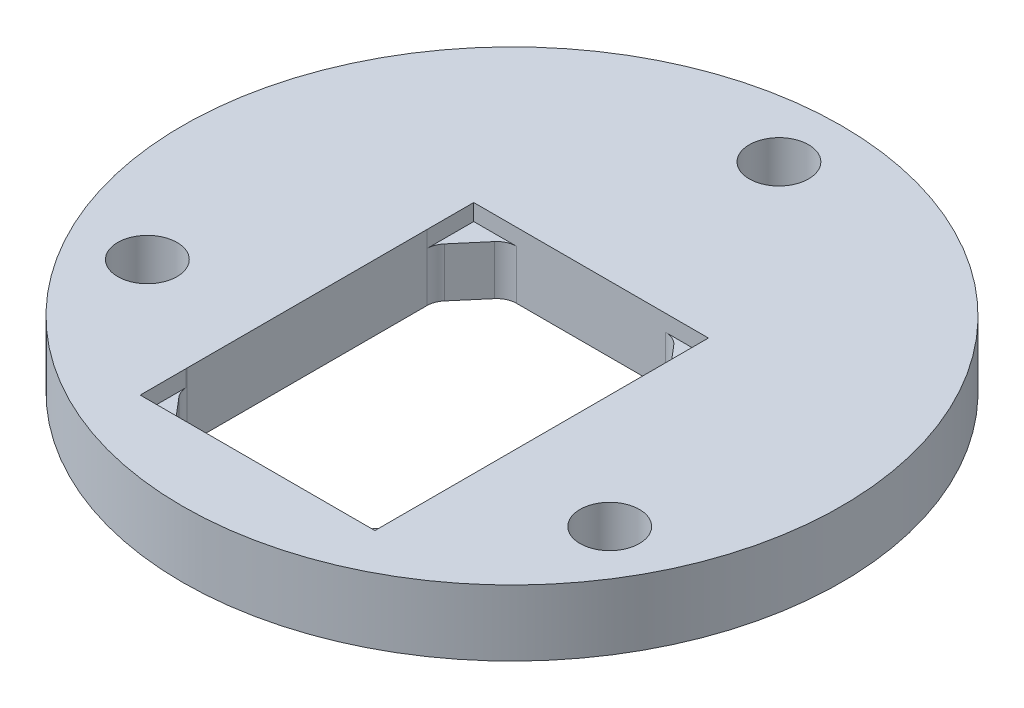
ISO-10303-21;
HEADER;
FILE_DESCRIPTION(('STEP AP214'),'2;1');
FILE_NAME('part.step','',(''),(''),'','','');
FILE_SCHEMA(('AUTOMOTIVE_DESIGN { 1 0 10303 214 1 1 1 1 }'));
ENDSEC;
DATA;
#1=APPLICATION_CONTEXT('core data for automotive mechanical design processes');
#2=APPLICATION_PROTOCOL_DEFINITION('international standard','automotive_design',2000,#1);
#3=PRODUCT_CONTEXT('',#1,'mechanical');
#4=PRODUCT('Part','Part','',(#3));
#5=PRODUCT_RELATED_PRODUCT_CATEGORY('part','',(#4));
#6=PRODUCT_DEFINITION_FORMATION('','',#4);
#7=PRODUCT_DEFINITION_CONTEXT('part definition',#1,'design');
#8=PRODUCT_DEFINITION('design','',#6,#7);
#9=PRODUCT_DEFINITION_SHAPE('','',#8);
#10=(LENGTH_UNIT() NAMED_UNIT(*) SI_UNIT(.MILLI.,.METRE.));
#11=(NAMED_UNIT(*) PLANE_ANGLE_UNIT() SI_UNIT($,.RADIAN.));
#12=(NAMED_UNIT(*) SI_UNIT($,.STERADIAN.) SOLID_ANGLE_UNIT());
#13=UNCERTAINTY_MEASURE_WITH_UNIT(LENGTH_MEASURE(1.E-05),#10,'distance_accuracy_value','');
#14=(GEOMETRIC_REPRESENTATION_CONTEXT(3) GLOBAL_UNCERTAINTY_ASSIGNED_CONTEXT((#13)) GLOBAL_UNIT_ASSIGNED_CONTEXT((#10,
#11,#12)) REPRESENTATION_CONTEXT('',''));
#15=CARTESIAN_POINT('',(0.,0.,0.));
#16=DIRECTION('',(0.,0.,1.));
#17=DIRECTION('',(1.,0.,0.));
#18=AXIS2_PLACEMENT_3D('',#15,#16,#17);
#19=CARTESIAN_POINT('',(-23.4903640908086,-25.,-15.7319703997902));
#20=DIRECTION('',(0.,1.,0.));
#21=DIRECTION('',(0.,0.,1.));
#22=AXIS2_PLACEMENT_3D('',#19,#20,#21);
#23=CYLINDRICAL_SURFACE('',#22,3.00000000000003);
#24=CARTESIAN_POINT('',(-23.4903640908086,7.5,-15.7319703997902));
#25=DIRECTION('',(0.,1.,0.));
#26=DIRECTION('',(0.,0.,1.));
#27=AXIS2_PLACEMENT_3D('',#24,#25,#26);
#28=CIRCLE('',#27,3.00000000000003);
#29=CARTESIAN_POINT('',(-26.490364083733,7.5,-15.7319703997902));
#30=VERTEX_POINT('',#29);
#31=CARTESIAN_POINT('',(-25.7740709174085,7.5,-17.6773966076278));
#32=VERTEX_POINT('',#31);
#33=EDGE_CURVE('E317',#30,#32,#28,.F.);
#34=ORIENTED_EDGE('',*,*,#33,.F.);
#35=DIRECTION('',(0.,1.,0.));
#36=VECTOR('',#35,1.);
#37=CARTESIAN_POINT('',(-26.4903640872708,-25.,-15.7319703997902));
#38=LINE('',#37,#36);
#39=CARTESIAN_POINT('',(-26.490364083733,10.,-15.7319703997902));
#40=VERTEX_POINT('',#39);
#41=EDGE_CURVE('E12',#40,#30,#38,.F.);
#42=ORIENTED_EDGE('',*,*,#41,.F.);
#43=CARTESIAN_POINT('',(-23.4903640908086,10.,-15.7319703997902));
#44=DIRECTION('',(0.,1.,0.));
#45=DIRECTION('',(0.,0.,1.));
#46=AXIS2_PLACEMENT_3D('',#43,#44,#45);
#47=CIRCLE('',#46,3.00000000000003);
#48=CARTESIAN_POINT('',(-26.490364083733,10.,-15.731764355845));
#49=VERTEX_POINT('',#48);
#50=EDGE_CURVE('E334',#40,#49,#47,.T.);
#51=ORIENTED_EDGE('',*,*,#50,.T.);
#52=DIRECTION('',(0.,1.,0.));
#53=VECTOR('',#52,1.);
#54=CARTESIAN_POINT('',(-26.490364083733,-25.,-15.731764355845));
#55=LINE('',#54,#53);
#56=CARTESIAN_POINT('',(-26.490364083733,0.,-15.731764355845));
#57=VERTEX_POINT('',#56);
#58=EDGE_CURVE('E359',#57,#49,#55,.T.);
#59=ORIENTED_EDGE('',*,*,#58,.F.);
#60=CARTESIAN_POINT('',(-23.4903640908086,0.,-15.7319703997902));
#61=DIRECTION('',(0.,1.,0.));
#62=DIRECTION('',(0.,0.,1.));
#63=AXIS2_PLACEMENT_3D('',#60,#61,#62);
#64=CIRCLE('',#63,3.00000000000003);
#65=CARTESIAN_POINT('',(-25.7740709174085,0.,-17.6773966076278));
#66=VERTEX_POINT('',#65);
#67=EDGE_CURVE('E426',#66,#57,#64,.T.);
#68=ORIENTED_EDGE('',*,*,#67,.F.);
#69=DIRECTION('',(0.,1.,0.));
#70=VECTOR('',#69,1.);
#71=CARTESIAN_POINT('',(-25.7740709174085,-25.,-17.6773966076278));
#72=LINE('',#71,#70);
#73=EDGE_CURVE('E361',#66,#32,#72,.T.);
#74=ORIENTED_EDGE('',*,*,#73,.T.);
#75=EDGE_LOOP('',(#34,#42,#51,#59,#68,#74));
#76=FACE_BOUND('',#75,.T.);
#77=ADVANCED_FACE('F91',(#76),#23,.F.);
#78=CARTESIAN_POINT('',(-23.6618651070982,-25.,-20.1568835235315));
#79=DIRECTION('',(0.761235608866611,0.,0.648475402612528));
#80=DIRECTION('',(0.648475402612528,0.,-0.761235608866611));
#81=AXIS2_PLACEMENT_3D('',#78,#79,#80);
#82=PLANE('',#81);
#83=DIRECTION('',(0.,1.,0.));
#84=VECTOR('',#83,1.);
#85=CARTESIAN_POINT('',(-22.2815709104518,-25.,-21.7771903061266));
#86=LINE('',#85,#84);
#87=CARTESIAN_POINT('',(-22.2815709104518,0.,-21.7771903061266));
#88=VERTEX_POINT('',#87);
#89=CARTESIAN_POINT('',(-22.2815709104518,7.5,-21.7771903061266));
#90=VERTEX_POINT('',#89);
#91=EDGE_CURVE('E364',#88,#90,#86,.T.);
#92=ORIENTED_EDGE('',*,*,#91,.T.);
#93=DIRECTION('',(-0.648475402612528,0.,0.761235608866611));
#94=VECTOR('',#93,1.);
#95=CARTESIAN_POINT('',(-23.6618651070982,7.5,-20.1568835235315));
#96=LINE('',#95,#94);
#97=EDGE_CURVE('E106',#90,#32,#96,.T.);
#98=ORIENTED_EDGE('',*,*,#97,.T.);
#99=ORIENTED_EDGE('',*,*,#73,.F.);
#100=DIRECTION('',(0.648475402612528,0.,-0.761235608866611));
#101=VECTOR('',#100,1.);
#102=CARTESIAN_POINT('',(-21.9661662866536,0.,-22.1474390925403));
#103=LINE('',#102,#101);
#104=EDGE_CURVE('E424',#66,#88,#103,.T.);
#105=ORIENTED_EDGE('',*,*,#104,.T.);
#106=EDGE_LOOP('',(#92,#98,#99,#105));
#107=FACE_BOUND('',#106,.T.);
#108=ADVANCED_FACE('F489',(#107),#82,.T.);
#109=CARTESIAN_POINT('',(-19.997864083852,-25.,-19.831764098289));
#110=DIRECTION('',(0.,1.,0.));
#111=DIRECTION('',(0.,0.,1.));
#112=AXIS2_PLACEMENT_3D('',#109,#110,#111);
#113=CYLINDRICAL_SURFACE('',#112,3.);
#114=CARTESIAN_POINT('',(-19.997864083852,7.5,-19.831764098289));
#115=DIRECTION('',(0.,1.,0.));
#116=DIRECTION('',(0.,0.,1.));
#117=AXIS2_PLACEMENT_3D('',#114,#115,#116);
#118=CIRCLE('',#117,3.);
#119=CARTESIAN_POINT('',(-19.997864083852,7.5,-22.831764098289));
#120=VERTEX_POINT('',#119);
#121=EDGE_CURVE('E314',#90,#120,#118,.F.);
#122=ORIENTED_EDGE('',*,*,#121,.F.);
#123=ORIENTED_EDGE('',*,*,#91,.F.);
#124=CARTESIAN_POINT('',(-19.997864083852,0.,-19.831764098289));
#125=DIRECTION('',(0.,1.,0.));
#126=DIRECTION('',(0.,0.,1.));
#127=AXIS2_PLACEMENT_3D('',#124,#125,#126);
#128=CIRCLE('',#127,3.);
#129=CARTESIAN_POINT('',(-19.997864083852,0.,-22.831764098289));
#130=VERTEX_POINT('',#129);
#131=EDGE_CURVE('E421',#130,#88,#128,.T.);
#132=ORIENTED_EDGE('',*,*,#131,.F.);
#133=DIRECTION('',(0.,1.,0.));
#134=VECTOR('',#133,1.);
#135=CARTESIAN_POINT('',(-19.997864083852,-25.,-22.831764098289));
#136=LINE('',#135,#134);
#137=EDGE_CURVE('E367',#130,#120,#136,.T.);
#138=ORIENTED_EDGE('',*,*,#137,.T.);
#139=EDGE_LOOP('',(#122,#123,#132,#138));
#140=FACE_BOUND('',#139,.T.);
#141=ADVANCED_FACE('F495',(#140),#113,.F.);
#142=CARTESIAN_POINT('',(2.63213591614804,-25.,-19.831764098289));
#143=DIRECTION('',(0.,1.,0.));
#144=DIRECTION('',(0.,0.,1.));
#145=AXIS2_PLACEMENT_3D('',#142,#143,#144);
#146=CYLINDRICAL_SURFACE('',#145,3.);
#147=CARTESIAN_POINT('',(2.63213591614804,7.5,-19.831764098289));
#148=DIRECTION('',(0.,1.,0.));
#149=DIRECTION('',(0.,0.,1.));
#150=AXIS2_PLACEMENT_3D('',#147,#148,#149);
#151=CIRCLE('',#150,3.);
#152=CARTESIAN_POINT('',(2.63213591614804,7.5,-22.831764098289));
#153=VERTEX_POINT('',#152);
#154=CARTESIAN_POINT('',(4.91891456032033,7.5,-21.773578567428));
#155=VERTEX_POINT('',#154);
#156=EDGE_CURVE('E312',#153,#155,#151,.F.);
#157=ORIENTED_EDGE('',*,*,#156,.F.);
#158=DIRECTION('',(0.,1.,0.));
#159=VECTOR('',#158,1.);
#160=CARTESIAN_POINT('',(2.63213591614804,-25.,-22.831764098289));
#161=LINE('',#160,#159);
#162=CARTESIAN_POINT('',(2.63213591614804,0.,-22.831764098289));
#163=VERTEX_POINT('',#162);
#164=EDGE_CURVE('E370',#163,#153,#161,.T.);
#165=ORIENTED_EDGE('',*,*,#164,.F.);
#166=CARTESIAN_POINT('',(2.63213591614804,0.,-19.831764098289));
#167=DIRECTION('',(0.,1.,0.));
#168=DIRECTION('',(0.,0.,1.));
#169=AXIS2_PLACEMENT_3D('',#166,#167,#168);
#170=CIRCLE('',#169,3.);
#171=CARTESIAN_POINT('',(4.91891456032033,0.,-21.773578567428));
#172=VERTEX_POINT('',#171);
#173=EDGE_CURVE('E416',#172,#163,#170,.T.);
#174=ORIENTED_EDGE('',*,*,#173,.F.);
#175=DIRECTION('',(0.,1.,0.));
#176=VECTOR('',#175,1.);
#177=CARTESIAN_POINT('',(4.91891456032033,-25.,-21.773578567428));
#178=LINE('',#177,#176);
#179=EDGE_CURVE('E373',#172,#155,#178,.T.);
#180=ORIENTED_EDGE('',*,*,#179,.T.);
#181=EDGE_LOOP('',(#157,#165,#174,#180));
#182=FACE_BOUND('',#181,.T.);
#183=ADVANCED_FACE('F505',(#182),#146,.F.);
#184=CARTESIAN_POINT('',(13.6009256354083,-25.,-11.5492044933272));
#185=DIRECTION('',(-0.76225954805743,0.,0.647271489712998));
#186=DIRECTION('',(0.647271489712998,0.,0.76225954805743));
#187=AXIS2_PLACEMENT_3D('',#184,#185,#186);
#188=PLANE('',#187);
#189=DIRECTION('',(0.,1.,0.));
#190=VECTOR('',#189,1.);
#191=CARTESIAN_POINT('',(8.40891456032033,-25.,-17.663578567428));
#192=LINE('',#191,#190);
#193=CARTESIAN_POINT('',(8.40891456032033,0.,-17.663578567428));
#194=VERTEX_POINT('',#193);
#195=CARTESIAN_POINT('',(8.40891456032033,7.5,-17.663578567428));
#196=VERTEX_POINT('',#195);
#197=EDGE_CURVE('E376',#194,#196,#192,.T.);
#198=ORIENTED_EDGE('',*,*,#197,.T.);
#199=DIRECTION('',(-0.647271489712998,0.,-0.76225954805743));
#200=VECTOR('',#199,1.);
#201=CARTESIAN_POINT('',(13.6009256354083,7.5,-11.5492044933272));
#202=LINE('',#201,#200);
#203=EDGE_CURVE('E114',#196,#155,#202,.T.);
#204=ORIENTED_EDGE('',*,*,#203,.T.);
#205=ORIENTED_EDGE('',*,*,#179,.F.);
#206=DIRECTION('',(0.647271489712998,0.,0.76225954805743));
#207=VECTOR('',#206,1.);
#208=CARTESIAN_POINT('',(4.61887770380443,0.,-22.1269171004597));
#209=LINE('',#208,#207);
#210=EDGE_CURVE('E414',#172,#194,#209,.T.);
#211=ORIENTED_EDGE('',*,*,#210,.T.);
#212=EDGE_LOOP('',(#198,#204,#205,#211));
#213=FACE_BOUND('',#212,.T.);
#214=ADVANCED_FACE('F514',(#213),#188,.T.);
#215=CARTESIAN_POINT('',(16.0358574951463,-25.,13.650034794649));
#216=DIRECTION('',(-0.761480874528557,0.,-0.648187378562113));
#217=DIRECTION('',(-0.648187378562113,0.,0.761480874528557));
#218=AXIS2_PLACEMENT_3D('',#215,#216,#217);
#219=PLANE('',#218);
#220=DIRECTION('',(0.,1.,0.));
#221=VECTOR('',#220,1.);
#222=CARTESIAN_POINT('',(4.91657853973371,-25.,26.7127980373973));
#223=LINE('',#222,#221);
#224=CARTESIAN_POINT('',(4.91657853973371,0.,26.7127980373973));
#225=VERTEX_POINT('',#224);
#226=CARTESIAN_POINT('',(4.91657853973371,7.5,26.7127980373973));
#227=VERTEX_POINT('',#226);
#228=EDGE_CURVE('E345',#225,#227,#223,.T.);
#229=ORIENTED_EDGE('',*,*,#228,.T.);
#230=DIRECTION('',(0.648187378562113,0.,-0.761480874528557));
#231=VECTOR('',#230,1.);
#232=CARTESIAN_POINT('',(16.0358574951463,7.5,13.650034794649));
#233=LINE('',#232,#231);
#234=CARTESIAN_POINT('',(8.40657853973371,7.5,22.6127980373973));
#235=VERTEX_POINT('',#234);
#236=EDGE_CURVE('E304',#227,#235,#233,.T.);
#237=ORIENTED_EDGE('',*,*,#236,.T.);
#238=DIRECTION('',(0.,1.,0.));
#239=VECTOR('',#238,1.);
#240=CARTESIAN_POINT('',(8.40657853973371,-25.,22.6127980373973));
#241=LINE('',#240,#239);
#242=CARTESIAN_POINT('',(8.40657853973371,0.,22.6127980373973));
#243=VERTEX_POINT('',#242);
#244=EDGE_CURVE('E384',#243,#235,#241,.T.);
#245=ORIENTED_EDGE('',*,*,#244,.F.);
#246=DIRECTION('',(-0.648187378562113,0.,0.761480874528557));
#247=VECTOR('',#246,1.);
#248=CARTESIAN_POINT('',(17.7341462093864,0.,11.654910517175));
#249=LINE('',#248,#247);
#250=EDGE_CURVE('E404',#243,#225,#249,.T.);
#251=ORIENTED_EDGE('',*,*,#250,.T.);
#252=EDGE_LOOP('',(#229,#237,#245,#251));
#253=FACE_BOUND('',#252,.T.);
#254=ADVANCED_FACE('F465',(#253),#219,.T.);
#255=CARTESIAN_POINT('',(2.63213591614804,-25.,24.768235901711));
#256=DIRECTION('',(0.,1.,0.));
#257=DIRECTION('',(0.,0.,1.));
#258=AXIS2_PLACEMENT_3D('',#255,#256,#257);
#259=CYLINDRICAL_SURFACE('',#258,3.);
#260=CARTESIAN_POINT('',(2.63213591614804,7.5,24.768235901711));
#261=DIRECTION('',(0.,1.,0.));
#262=DIRECTION('',(0.,0.,1.));
#263=AXIS2_PLACEMENT_3D('',#260,#261,#262);
#264=CIRCLE('',#263,3.);
#265=CARTESIAN_POINT('',(2.63213591614804,7.5,27.768235901711));
#266=VERTEX_POINT('',#265);
#267=EDGE_CURVE('E302',#227,#266,#264,.F.);
#268=ORIENTED_EDGE('',*,*,#267,.F.);
#269=ORIENTED_EDGE('',*,*,#228,.F.);
#270=CARTESIAN_POINT('',(2.63213591614804,0.,24.768235901711));
#271=DIRECTION('',(0.,1.,0.));
#272=DIRECTION('',(0.,0.,1.));
#273=AXIS2_PLACEMENT_3D('',#270,#271,#272);
#274=CIRCLE('',#273,3.);
#275=CARTESIAN_POINT('',(2.63213591614804,0.,27.768235901711));
#276=VERTEX_POINT('',#275);
#277=EDGE_CURVE('E401',#276,#225,#274,.T.);
#278=ORIENTED_EDGE('',*,*,#277,.F.);
#279=DIRECTION('',(0.,1.,0.));
#280=VECTOR('',#279,1.);
#281=CARTESIAN_POINT('',(2.63213591614804,-25.,27.768235901711));
#282=LINE('',#281,#280);
#283=EDGE_CURVE('E346',#276,#266,#282,.T.);
#284=ORIENTED_EDGE('',*,*,#283,.T.);
#285=EDGE_LOOP('',(#268,#269,#278,#284));
#286=FACE_BOUND('',#285,.T.);
#287=ADVANCED_FACE('F468',(#286),#259,.F.);
#288=CARTESIAN_POINT('',(-20.002864083852,-25.,24.768235901711));
#289=DIRECTION('',(0.,1.,0.));
#290=DIRECTION('',(0.,0.,1.));
#291=AXIS2_PLACEMENT_3D('',#288,#289,#290);
#292=CYLINDRICAL_SURFACE('',#291,3.);
#293=CARTESIAN_POINT('',(-20.002864083852,7.5,24.768235901711));
#294=DIRECTION('',(0.,1.,0.));
#295=DIRECTION('',(0.,0.,1.));
#296=AXIS2_PLACEMENT_3D('',#293,#294,#295);
#297=CIRCLE('',#296,3.);
#298=CARTESIAN_POINT('',(-20.002864083852,7.5,27.768235901711));
#299=VERTEX_POINT('',#298);
#300=CARTESIAN_POINT('',(-22.2873067074376,7.5,26.7127980373973));
#301=VERTEX_POINT('',#300);
#302=EDGE_CURVE('E294',#299,#301,#297,.F.);
#303=ORIENTED_EDGE('',*,*,#302,.F.);
#304=DIRECTION('',(0.,1.,0.));
#305=VECTOR('',#304,1.);
#306=CARTESIAN_POINT('',(-20.002864083852,-25.,27.768235901711));
#307=LINE('',#306,#305);
#308=CARTESIAN_POINT('',(-20.002864083852,0.,27.768235901711));
#309=VERTEX_POINT('',#308);
#310=EDGE_CURVE('E276',#309,#299,#307,.T.);
#311=ORIENTED_EDGE('',*,*,#310,.F.);
#312=CARTESIAN_POINT('',(-20.002864083852,0.,24.768235901711));
#313=DIRECTION('',(0.,1.,0.));
#314=DIRECTION('',(0.,0.,1.));
#315=AXIS2_PLACEMENT_3D('',#312,#313,#314);
#316=CIRCLE('',#315,3.);
#317=CARTESIAN_POINT('',(-22.2873067074376,0.,26.7127980373973));
#318=VERTEX_POINT('',#317);
#319=EDGE_CURVE('E396',#318,#309,#316,.T.);
#320=ORIENTED_EDGE('',*,*,#319,.F.);
#321=DIRECTION('',(0.,1.,0.));
#322=VECTOR('',#321,1.);
#323=CARTESIAN_POINT('',(-22.2873067074376,-25.,26.7127980373973));
#324=LINE('',#323,#322);
#325=EDGE_CURVE('E351',#318,#301,#324,.T.);
#326=ORIENTED_EDGE('',*,*,#325,.T.);
#327=EDGE_LOOP('',(#303,#311,#320,#326));
#328=FACE_BOUND('',#327,.T.);
#329=ADVANCED_FACE('F530',(#328),#292,.F.);
#330=CARTESIAN_POINT('',(-26.1083284593411,-25.,22.2239186153904));
#331=DIRECTION('',(0.761480874528557,0.,-0.648187378562114));
#332=DIRECTION('',(-0.648187378562114,0.,-0.761480874528557));
#333=AXIS2_PLACEMENT_3D('',#330,#331,#332);
#334=PLANE('',#333);
#335=DIRECTION('',(0.,1.,0.));
#336=VECTOR('',#335,1.);
#337=CARTESIAN_POINT('',(-25.7773067074376,-25.,22.6127980373973));
#338=LINE('',#337,#336);
#339=CARTESIAN_POINT('',(-25.7773067074376,0.,22.6127980373973));
#340=VERTEX_POINT('',#339);
#341=CARTESIAN_POINT('',(-25.7773067074376,7.5,22.6127980373973));
#342=VERTEX_POINT('',#341);
#343=EDGE_CURVE('E354',#340,#342,#338,.T.);
#344=ORIENTED_EDGE('',*,*,#343,.T.);
#345=DIRECTION('',(0.648187378562114,0.,0.761480874528557));
#346=VECTOR('',#345,1.);
#347=CARTESIAN_POINT('',(-26.1083284593411,7.5,22.2239186153904));
#348=LINE('',#347,#346);
#349=EDGE_CURVE('E434',#342,#301,#348,.T.);
#350=ORIENTED_EDGE('',*,*,#349,.T.);
#351=ORIENTED_EDGE('',*,*,#325,.F.);
#352=DIRECTION('',(-0.648187378562114,0.,-0.761480874528557));
#353=VECTOR('',#352,1.);
#354=CARTESIAN_POINT('',(-35.1027736427018,0.,11.6573784286343));
#355=LINE('',#354,#353);
#356=EDGE_CURVE('E392',#318,#340,#355,.T.);
#357=ORIENTED_EDGE('',*,*,#356,.T.);
#358=EDGE_LOOP('',(#344,#350,#351,#357));
#359=FACE_BOUND('',#358,.T.);
#360=ADVANCED_FACE('F598',(#359),#334,.T.);
#361=CARTESIAN_POINT('',(-8.68286408385213,10.,-10.831764098289));
#362=DIRECTION('',(0.,-1.,0.));
#363=DIRECTION('',(0.,0.,-1.));
#364=AXIS2_PLACEMENT_3D('',#361,#362,#363);
#365=CYLINDRICAL_SURFACE('',#364,50.);
#366=CARTESIAN_POINT('',(-8.68286408385213,10.,-10.831764098289));
#367=DIRECTION('',(0.,1.,0.));
#368=DIRECTION('',(0.,0.,1.));
#369=AXIS2_PLACEMENT_3D('',#366,#367,#368);
#370=CIRCLE('',#369,50.);
#371=CARTESIAN_POINT('',(-8.68286408385213,10.,39.168235901711));
#372=VERTEX_POINT('',#371);
#373=EDGE_CURVE('E389',#372,#372,#370,.T.);
#374=ORIENTED_EDGE('',*,*,#373,.F.);
#375=EDGE_LOOP('',(#374));
#376=FACE_BOUND('',#375,.T.);
#377=CARTESIAN_POINT('',(-8.68286408385213,0.,-10.831764098289));
#378=DIRECTION('',(0.,1.,0.));
#379=DIRECTION('',(0.,0.,1.));
#380=AXIS2_PLACEMENT_3D('',#377,#378,#379);
#381=CIRCLE('',#380,50.);
#382=CARTESIAN_POINT('',(-8.68286408385213,0.,39.168235901711));
#383=VERTEX_POINT('',#382);
#384=EDGE_CURVE('E349',#383,#383,#381,.T.);
#385=ORIENTED_EDGE('',*,*,#384,.T.);
#386=EDGE_LOOP('',(#385));
#387=FACE_BOUND('',#386,.T.);
#388=ADVANCED_FACE('F93',(#376,#387),#365,.T.);
#389=CARTESIAN_POINT('',(-8.68286408385213,10.,-10.831764098289));
#390=DIRECTION('',(0.,1.,0.));
#391=DIRECTION('',(0.,0.,1.));
#392=AXIS2_PLACEMENT_3D('',#389,#390,#391);
#393=PLANE('',#392);
#394=CARTESIAN_POINT('',(-8.68286408385213,10.,-51.331764098289));
#395=DIRECTION('',(0.,1.,0.));
#396=DIRECTION('',(0.,0.,1.));
#397=AXIS2_PLACEMENT_3D('',#394,#395,#396);
#398=CIRCLE('',#397,4.5);
#399=CARTESIAN_POINT('',(-8.68286408385213,10.,-46.831764098289));
#400=VERTEX_POINT('',#399);
#401=EDGE_CURVE('E560',#400,#400,#398,.T.);
#402=ORIENTED_EDGE('',*,*,#401,.F.);
#403=EDGE_LOOP('',(#402));
#404=FACE_BOUND('',#403,.T.);
#405=CARTESIAN_POINT('',(-43.7568929371218,10.,9.41823590171113));
#406=DIRECTION('',(0.,1.,0.));
#407=DIRECTION('',(0.,0.,1.));
#408=AXIS2_PLACEMENT_3D('',#405,#406,#407);
#409=CIRCLE('',#408,4.50000000000001);
#410=CARTESIAN_POINT('',(-43.7568929371218,10.,13.9182359017111));
#411=VERTEX_POINT('',#410);
#412=EDGE_CURVE('E556',#411,#411,#409,.T.);
#413=ORIENTED_EDGE('',*,*,#412,.F.);
#414=EDGE_LOOP('',(#413));
#415=FACE_BOUND('',#414,.T.);
#416=CARTESIAN_POINT('',(26.3911647694175,10.,9.41823590171113));
#417=DIRECTION('',(0.,1.,0.));
#418=DIRECTION('',(0.,0.,1.));
#419=AXIS2_PLACEMENT_3D('',#416,#417,#418);
#420=CIRCLE('',#419,4.5);
#421=CARTESIAN_POINT('',(26.3911647694175,10.,13.9182359017111));
#422=VERTEX_POINT('',#421);
#423=EDGE_CURVE('E552',#422,#422,#420,.T.);
#424=ORIENTED_EDGE('',*,*,#423,.F.);
#425=EDGE_LOOP('',(#424));
#426=FACE_BOUND('',#425,.T.);
#427=DIRECTION('',(0.,0.,1.));
#428=VECTOR('',#427,1.);
#429=CARTESIAN_POINT('',(-26.490364083733,10.,-22.831764098289));
#430=LINE('',#429,#428);
#431=CARTESIAN_POINT('',(-26.490364083733,10.,-22.831764098289));
#432=VERTEX_POINT('',#431);
#433=EDGE_CURVE('E287',#432,#40,#430,.T.);
#434=ORIENTED_EDGE('',*,*,#433,.F.);
#435=DIRECTION('',(1.,0.,0.));
#436=VECTOR('',#435,1.);
#437=CARTESIAN_POINT('',(0.,10.,-22.831764098289));
#438=LINE('',#437,#436);
#439=CARTESIAN_POINT('',(9.11713591614804,10.,-22.831764098289));
#440=VERTEX_POINT('',#439);
#441=EDGE_CURVE('E332',#432,#440,#438,.T.);
#442=ORIENTED_EDGE('',*,*,#441,.T.);
#443=DIRECTION('',(0.,0.,-1.));
#444=VECTOR('',#443,1.);
#445=CARTESIAN_POINT('',(9.11713591614804,10.,-22.831764098289));
#446=LINE('',#445,#444);
#447=CARTESIAN_POINT('',(9.11713591614804,10.,-15.8948969952208));
#448=VERTEX_POINT('',#447);
#449=EDGE_CURVE('E289',#448,#440,#446,.T.);
#450=ORIENTED_EDGE('',*,*,#449,.F.);
#451=CARTESIAN_POINT('',(6.12213591614804,10.,-15.721764098289));
#452=DIRECTION('',(0.,1.,0.));
#453=DIRECTION('',(0.,0.,1.));
#454=AXIS2_PLACEMENT_3D('',#451,#452,#453);
#455=CIRCLE('',#454,3.);
#456=CARTESIAN_POINT('',(9.12213591614804,10.,-15.721764098289));
#457=VERTEX_POINT('',#456);
#458=EDGE_CURVE('E329',#457,#448,#455,.T.);
#459=ORIENTED_EDGE('',*,*,#458,.F.);
#460=DIRECTION('',(0.,0.,1.));
#461=VECTOR('',#460,1.);
#462=CARTESIAN_POINT('',(9.12213591614804,10.,0.));
#463=LINE('',#462,#461);
#464=CARTESIAN_POINT('',(9.12213591614804,10.,20.668235901711));
#465=VERTEX_POINT('',#464);
#466=EDGE_CURVE('E326',#457,#465,#463,.T.);
#467=ORIENTED_EDGE('',*,*,#466,.T.);
#468=CARTESIAN_POINT('',(6.12213591614804,10.,20.668235901711));
#469=DIRECTION('',(0.,1.,0.));
#470=DIRECTION('',(0.,0.,1.));
#471=AXIS2_PLACEMENT_3D('',#468,#469,#470);
#472=CIRCLE('',#471,3.);
#473=CARTESIAN_POINT('',(9.11713591614804,10.,20.8413687986426));
#474=VERTEX_POINT('',#473);
#475=EDGE_CURVE('E324',#474,#465,#472,.T.);
#476=ORIENTED_EDGE('',*,*,#475,.F.);
#477=CARTESIAN_POINT('',(9.11713591614804,10.,27.768235901711));
#478=VERTEX_POINT('',#477);
#479=EDGE_CURVE('E261',#478,#474,#446,.T.);
#480=ORIENTED_EDGE('',*,*,#479,.F.);
#481=DIRECTION('',(-1.,0.,0.));
#482=VECTOR('',#481,1.);
#483=CARTESIAN_POINT('',(0.,10.,27.768235901711));
#484=LINE('',#483,#482);
#485=CARTESIAN_POINT('',(-26.490364083733,10.,27.768235901711));
#486=VERTEX_POINT('',#485);
#487=EDGE_CURVE('E343',#478,#486,#484,.T.);
#488=ORIENTED_EDGE('',*,*,#487,.T.);
#489=CARTESIAN_POINT('',(-26.490364083733,10.,20.7906848735866));
#490=VERTEX_POINT('',#489);
#491=EDGE_CURVE('E268',#490,#486,#430,.T.);
#492=ORIENTED_EDGE('',*,*,#491,.F.);
#493=CARTESIAN_POINT('',(-23.492864083852,10.,20.668235901711));
#494=DIRECTION('',(0.,1.,0.));
#495=DIRECTION('',(0.,0.,1.));
#496=AXIS2_PLACEMENT_3D('',#493,#494,#495);
#497=CIRCLE('',#496,3.);
#498=CARTESIAN_POINT('',(-26.4928640555492,10.,20.6678238138028));
#499=VERTEX_POINT('',#498);
#500=EDGE_CURVE('E340',#499,#490,#497,.T.);
#501=ORIENTED_EDGE('',*,*,#500,.F.);
#502=DIRECTION('',(6.86813213030968E-05,0.,-0.999999997641438));
#503=VECTOR('',#502,1.);
#504=CARTESIAN_POINT('',(-26.4914444371345,10.,-0.00181946741146129));
#505=LINE('',#504,#503);
#506=EDGE_CURVE('E337',#499,#49,#505,.T.);
#507=ORIENTED_EDGE('',*,*,#506,.T.);
#508=ORIENTED_EDGE('',*,*,#50,.F.);
#509=EDGE_LOOP('',(#434,#442,#450,#459,#467,#476,#480,#488,#492,#501,#507,#508));
#510=FACE_BOUND('',#509,.T.);
#511=ORIENTED_EDGE('',*,*,#373,.T.);
#512=EDGE_LOOP('',(#511));
#513=FACE_BOUND('',#512,.T.);
#514=ADVANCED_FACE('F447',(#404,#415,#426,#510,#513),#393,.T.);
#515=CARTESIAN_POINT('',(-8.68286408385213,0.,-10.831764098289));
#516=DIRECTION('',(0.,1.,0.));
#517=DIRECTION('',(0.,0.,1.));
#518=AXIS2_PLACEMENT_3D('',#515,#516,#517);
#519=PLANE('',#518);
#520=CARTESIAN_POINT('',(-8.68286408385213,0.,-51.331764098289));
#521=DIRECTION('',(0.,1.,0.));
#522=DIRECTION('',(0.,0.,1.));
#523=AXIS2_PLACEMENT_3D('',#520,#521,#522);
#524=CIRCLE('',#523,4.5);
#525=CARTESIAN_POINT('',(-8.68286408385213,0.,-46.831764098289));
#526=VERTEX_POINT('',#525);
#527=EDGE_CURVE('E543',#526,#526,#524,.T.);
#528=ORIENTED_EDGE('',*,*,#527,.T.);
#529=EDGE_LOOP('',(#528));
#530=FACE_BOUND('',#529,.T.);
#531=CARTESIAN_POINT('',(-43.7568929371218,0.,9.41823590171113));
#532=DIRECTION('',(0.,1.,0.));
#533=DIRECTION('',(0.,0.,1.));
#534=AXIS2_PLACEMENT_3D('',#531,#532,#533);
#535=CIRCLE('',#534,4.50000000000001);
#536=CARTESIAN_POINT('',(-43.7568929371218,0.,13.9182359017111));
#537=VERTEX_POINT('',#536);
#538=EDGE_CURVE('E547',#537,#537,#535,.T.);
#539=ORIENTED_EDGE('',*,*,#538,.T.);
#540=EDGE_LOOP('',(#539));
#541=FACE_BOUND('',#540,.T.);
#542=CARTESIAN_POINT('',(26.3911647694175,0.,9.41823590171113));
#543=DIRECTION('',(0.,1.,0.));
#544=DIRECTION('',(0.,0.,1.));
#545=AXIS2_PLACEMENT_3D('',#542,#543,#544);
#546=CIRCLE('',#545,4.5);
#547=CARTESIAN_POINT('',(26.3911647694175,0.,13.9182359017111));
#548=VERTEX_POINT('',#547);
#549=EDGE_CURVE('E550',#548,#548,#546,.T.);
#550=ORIENTED_EDGE('',*,*,#549,.T.);
#551=EDGE_LOOP('',(#550));
#552=FACE_BOUND('',#551,.T.);
#553=DIRECTION('',(6.86813213030968E-05,0.,-0.999999997641438));
#554=VECTOR('',#553,1.);
#555=CARTESIAN_POINT('',(-26.490700538224,0.,-10.8329871640292));
#556=LINE('',#555,#554);
#557=CARTESIAN_POINT('',(-26.4928640555492,0.,20.6678238138028));
#558=VERTEX_POINT('',#557);
#559=EDGE_CURVE('E429',#558,#57,#556,.T.);
#560=ORIENTED_EDGE('',*,*,#559,.F.);
#561=CARTESIAN_POINT('',(-23.492864083852,0.,20.668235901711));
#562=DIRECTION('',(0.,1.,0.));
#563=DIRECTION('',(0.,0.,1.));
#564=AXIS2_PLACEMENT_3D('',#561,#562,#563);
#565=CIRCLE('',#564,3.);
#566=EDGE_CURVE('E431',#558,#340,#565,.T.);
#567=ORIENTED_EDGE('',*,*,#566,.T.);
#568=ORIENTED_EDGE('',*,*,#356,.F.);
#569=ORIENTED_EDGE('',*,*,#319,.T.);
#570=DIRECTION('',(-1.,0.,0.));
#571=VECTOR('',#570,1.);
#572=CARTESIAN_POINT('',(-8.68286408385212,0.,27.768235901711));
#573=LINE('',#572,#571);
#574=EDGE_CURVE('E399',#276,#309,#573,.T.);
#575=ORIENTED_EDGE('',*,*,#574,.F.);
#576=ORIENTED_EDGE('',*,*,#277,.T.);
#577=ORIENTED_EDGE('',*,*,#250,.F.);
#578=CARTESIAN_POINT('',(6.12213591614804,0.,20.668235901711));
#579=DIRECTION('',(0.,1.,0.));
#580=DIRECTION('',(0.,0.,1.));
#581=AXIS2_PLACEMENT_3D('',#578,#579,#580);
#582=CIRCLE('',#581,3.);
#583=CARTESIAN_POINT('',(9.12213591614804,0.,20.668235901711));
#584=VERTEX_POINT('',#583);
#585=EDGE_CURVE('E406',#243,#584,#582,.T.);
#586=ORIENTED_EDGE('',*,*,#585,.T.);
#587=DIRECTION('',(0.,0.,1.));
#588=VECTOR('',#587,1.);
#589=CARTESIAN_POINT('',(9.12213591614804,0.,-10.831764098289));
#590=LINE('',#589,#588);
#591=CARTESIAN_POINT('',(9.12213591614804,0.,-15.721764098289));
#592=VERTEX_POINT('',#591);
#593=EDGE_CURVE('E409',#592,#584,#590,.T.);
#594=ORIENTED_EDGE('',*,*,#593,.F.);
#595=CARTESIAN_POINT('',(6.12213591614804,0.,-15.721764098289));
#596=DIRECTION('',(0.,1.,0.));
#597=DIRECTION('',(0.,0.,1.));
#598=AXIS2_PLACEMENT_3D('',#595,#596,#597);
#599=CIRCLE('',#598,3.);
#600=EDGE_CURVE('E411',#592,#194,#599,.T.);
#601=ORIENTED_EDGE('',*,*,#600,.T.);
#602=ORIENTED_EDGE('',*,*,#210,.F.);
#603=ORIENTED_EDGE('',*,*,#173,.T.);
#604=DIRECTION('',(1.,0.,0.));
#605=VECTOR('',#604,1.);
#606=CARTESIAN_POINT('',(-8.68286408385213,0.,-22.831764098289));
#607=LINE('',#606,#605);
#608=EDGE_CURVE('E419',#130,#163,#607,.T.);
#609=ORIENTED_EDGE('',*,*,#608,.F.);
#610=ORIENTED_EDGE('',*,*,#131,.T.);
#611=ORIENTED_EDGE('',*,*,#104,.F.);
#612=ORIENTED_EDGE('',*,*,#67,.T.);
#613=EDGE_LOOP('',(#560,#567,#568,#569,#575,#576,#577,#586,#594,#601,#602,#603,#609,#610,#611,#612));
#614=FACE_BOUND('',#613,.T.);
#615=ORIENTED_EDGE('',*,*,#384,.F.);
#616=EDGE_LOOP('',(#615));
#617=FACE_BOUND('',#616,.T.);
#618=ADVANCED_FACE('F460',(#530,#541,#552,#614,#617),#519,.F.);
#619=CARTESIAN_POINT('',(-23.492864083852,-25.,20.668235901711));
#620=DIRECTION('',(0.,1.,0.));
#621=DIRECTION('',(0.,0.,1.));
#622=AXIS2_PLACEMENT_3D('',#619,#620,#621);
#623=CYLINDRICAL_SURFACE('',#622,3.);
#624=ORIENTED_EDGE('',*,*,#500,.T.);
#625=DIRECTION('',(0.,1.,0.));
#626=VECTOR('',#625,1.);
#627=CARTESIAN_POINT('',(-26.490364083733,-25.,20.7906848735866));
#628=LINE('',#627,#626);
#629=CARTESIAN_POINT('',(-26.490364083733,7.5,20.7906848735866));
#630=VERTEX_POINT('',#629);
#631=EDGE_CURVE('E322',#490,#630,#628,.F.);
#632=ORIENTED_EDGE('',*,*,#631,.T.);
#633=CARTESIAN_POINT('',(-23.492864083852,7.5,20.668235901711));
#634=DIRECTION('',(0.,1.,0.));
#635=DIRECTION('',(0.,0.,1.));
#636=AXIS2_PLACEMENT_3D('',#633,#634,#635);
#637=CIRCLE('',#636,3.);
#638=EDGE_CURVE('E257',#342,#630,#637,.F.);
#639=ORIENTED_EDGE('',*,*,#638,.F.);
#640=ORIENTED_EDGE('',*,*,#343,.F.);
#641=ORIENTED_EDGE('',*,*,#566,.F.);
#642=DIRECTION('',(0.,1.,0.));
#643=VECTOR('',#642,1.);
#644=CARTESIAN_POINT('',(-26.4928640555492,-25.,20.6678238138028));
#645=LINE('',#644,#643);
#646=EDGE_CURVE('E357',#558,#499,#645,.T.);
#647=ORIENTED_EDGE('',*,*,#646,.T.);
#648=EDGE_LOOP('',(#624,#632,#639,#640,#641,#647));
#649=FACE_BOUND('',#648,.T.);
#650=ADVANCED_FACE('F534',(#649),#623,.F.);
#651=CARTESIAN_POINT('',(-26.4914444371345,-25.,-0.00181946741146129));
#652=DIRECTION('',(0.999999997641438,0.,6.86813213030968E-05));
#653=DIRECTION('',(6.86813213030968E-05,0.,-0.999999997641438));
#654=AXIS2_PLACEMENT_3D('',#651,#652,#653);
#655=PLANE('',#654);
#656=ORIENTED_EDGE('',*,*,#559,.T.);
#657=ORIENTED_EDGE('',*,*,#58,.T.);
#658=ORIENTED_EDGE('',*,*,#506,.F.);
#659=ORIENTED_EDGE('',*,*,#646,.F.);
#660=EDGE_LOOP('',(#656,#657,#658,#659));
#661=FACE_BOUND('',#660,.T.);
#662=ADVANCED_FACE('F500',(#661),#655,.T.);
#663=CARTESIAN_POINT('',(0.,-25.,-22.831764098289));
#664=DIRECTION('',(0.,0.,1.));
#665=DIRECTION('',(1.,0.,0.));
#666=AXIS2_PLACEMENT_3D('',#663,#664,#665);
#667=PLANE('',#666);
#668=ORIENTED_EDGE('',*,*,#441,.F.);
#669=DIRECTION('',(0.,1.,0.));
#670=VECTOR('',#669,1.);
#671=CARTESIAN_POINT('',(-26.490364083733,7.5,-22.831764098289));
#672=LINE('',#671,#670);
#673=CARTESIAN_POINT('',(-26.490364083733,7.5,-22.831764098289));
#674=VERTEX_POINT('',#673);
#675=EDGE_CURVE('E291',#674,#432,#672,.T.);
#676=ORIENTED_EDGE('',*,*,#675,.F.);
#677=DIRECTION('',(-1.,0.,0.));
#678=VECTOR('',#677,1.);
#679=CARTESIAN_POINT('',(-26.490364083733,7.5,-22.831764098289));
#680=LINE('',#679,#678);
#681=EDGE_CURVE('E285',#120,#674,#680,.T.);
#682=ORIENTED_EDGE('',*,*,#681,.F.);
#683=ORIENTED_EDGE('',*,*,#137,.F.);
#684=ORIENTED_EDGE('',*,*,#608,.T.);
#685=ORIENTED_EDGE('',*,*,#164,.T.);
#686=CARTESIAN_POINT('',(9.11713591614804,7.5,-22.831764098289));
#687=VERTEX_POINT('',#686);
#688=EDGE_CURVE('E271',#687,#153,#680,.T.);
#689=ORIENTED_EDGE('',*,*,#688,.F.);
#690=DIRECTION('',(0.,1.,0.));
#691=VECTOR('',#690,1.);
#692=CARTESIAN_POINT('',(9.11713591614804,7.5,-22.831764098289));
#693=LINE('',#692,#691);
#694=EDGE_CURVE('E295',#687,#440,#693,.T.);
#695=ORIENTED_EDGE('',*,*,#694,.T.);
#696=EDGE_LOOP('',(#668,#676,#682,#683,#684,#685,#689,#695));
#697=FACE_BOUND('',#696,.T.);
#698=ADVANCED_FACE('F507',(#697),#667,.T.);
#699=CARTESIAN_POINT('',(6.12213591614804,-25.,-15.721764098289));
#700=DIRECTION('',(0.,1.,0.));
#701=DIRECTION('',(0.,0.,1.));
#702=AXIS2_PLACEMENT_3D('',#699,#700,#701);
#703=CYLINDRICAL_SURFACE('',#702,3.);
#704=ORIENTED_EDGE('',*,*,#458,.T.);
#705=DIRECTION('',(0.,1.,0.));
#706=VECTOR('',#705,1.);
#707=CARTESIAN_POINT('',(9.11713591614804,-25.,-15.8948969952208));
#708=LINE('',#707,#706);
#709=CARTESIAN_POINT('',(9.11713591614804,7.5,-15.8948969952208));
#710=VERTEX_POINT('',#709);
#711=EDGE_CURVE('E319',#448,#710,#708,.F.);
#712=ORIENTED_EDGE('',*,*,#711,.T.);
#713=CARTESIAN_POINT('',(6.12213591614804,7.5,-15.721764098289));
#714=DIRECTION('',(0.,1.,0.));
#715=DIRECTION('',(0.,0.,1.));
#716=AXIS2_PLACEMENT_3D('',#713,#714,#715);
#717=CIRCLE('',#716,3.);
#718=EDGE_CURVE('E309',#196,#710,#717,.F.);
#719=ORIENTED_EDGE('',*,*,#718,.F.);
#720=ORIENTED_EDGE('',*,*,#197,.F.);
#721=ORIENTED_EDGE('',*,*,#600,.F.);
#722=DIRECTION('',(0.,1.,0.));
#723=VECTOR('',#722,1.);
#724=CARTESIAN_POINT('',(9.12213591614804,-25.,-15.721764098289));
#725=LINE('',#724,#723);
#726=EDGE_CURVE('E379',#592,#457,#725,.T.);
#727=ORIENTED_EDGE('',*,*,#726,.T.);
#728=EDGE_LOOP('',(#704,#712,#719,#720,#721,#727));
#729=FACE_BOUND('',#728,.T.);
#730=ADVANCED_FACE('F510',(#729),#703,.F.);
#731=CARTESIAN_POINT('',(9.12213591614804,-25.,0.));
#732=DIRECTION('',(-1.,0.,0.));
#733=DIRECTION('',(0.,0.,1.));
#734=AXIS2_PLACEMENT_3D('',#731,#732,#733);
#735=PLANE('',#734);
#736=ORIENTED_EDGE('',*,*,#593,.T.);
#737=DIRECTION('',(0.,1.,0.));
#738=VECTOR('',#737,1.);
#739=CARTESIAN_POINT('',(9.12213591614804,-25.,20.668235901711));
#740=LINE('',#739,#738);
#741=EDGE_CURVE('E381',#584,#465,#740,.T.);
#742=ORIENTED_EDGE('',*,*,#741,.T.);
#743=ORIENTED_EDGE('',*,*,#466,.F.);
#744=ORIENTED_EDGE('',*,*,#726,.F.);
#745=EDGE_LOOP('',(#736,#742,#743,#744));
#746=FACE_BOUND('',#745,.T.);
#747=ADVANCED_FACE('F454',(#746),#735,.T.);
#748=CARTESIAN_POINT('',(6.12213591614804,-25.,20.668235901711));
#749=DIRECTION('',(0.,1.,0.));
#750=DIRECTION('',(0.,0.,1.));
#751=AXIS2_PLACEMENT_3D('',#748,#749,#750);
#752=CYLINDRICAL_SURFACE('',#751,3.);
#753=CARTESIAN_POINT('',(6.12213591614804,7.5,20.668235901711));
#754=DIRECTION('',(0.,1.,0.));
#755=DIRECTION('',(0.,0.,1.));
#756=AXIS2_PLACEMENT_3D('',#753,#754,#755);
#757=CIRCLE('',#756,3.);
#758=CARTESIAN_POINT('',(9.11713591614804,7.5,20.8413687986426));
#759=VERTEX_POINT('',#758);
#760=EDGE_CURVE('E307',#759,#235,#757,.F.);
#761=ORIENTED_EDGE('',*,*,#760,.F.);
#762=DIRECTION('',(0.,1.,0.));
#763=VECTOR('',#762,1.);
#764=CARTESIAN_POINT('',(9.11713591614804,-25.,20.8413687986426));
#765=LINE('',#764,#763);
#766=EDGE_CURVE('E99',#759,#474,#765,.T.);
#767=ORIENTED_EDGE('',*,*,#766,.T.);
#768=ORIENTED_EDGE('',*,*,#475,.T.);
#769=ORIENTED_EDGE('',*,*,#741,.F.);
#770=ORIENTED_EDGE('',*,*,#585,.F.);
#771=ORIENTED_EDGE('',*,*,#244,.T.);
#772=EDGE_LOOP('',(#761,#767,#768,#769,#770,#771));
#773=FACE_BOUND('',#772,.T.);
#774=ADVANCED_FACE('F440',(#773),#752,.F.);
#775=CARTESIAN_POINT('',(0.,-25.,27.768235901711));
#776=DIRECTION('',(0.,0.,-1.));
#777=DIRECTION('',(-1.,0.,0.));
#778=AXIS2_PLACEMENT_3D('',#775,#776,#777);
#779=PLANE('',#778);
#780=ORIENTED_EDGE('',*,*,#487,.F.);
#781=DIRECTION('',(0.,1.,0.));
#782=VECTOR('',#781,1.);
#783=CARTESIAN_POINT('',(9.11713591614804,7.5,27.768235901711));
#784=LINE('',#783,#782);
#785=CARTESIAN_POINT('',(9.11713591614804,7.5,27.768235901711));
#786=VERTEX_POINT('',#785);
#787=EDGE_CURVE('E270',#786,#478,#784,.T.);
#788=ORIENTED_EDGE('',*,*,#787,.F.);
#789=DIRECTION('',(1.,0.,0.));
#790=VECTOR('',#789,1.);
#791=CARTESIAN_POINT('',(-26.490364083733,7.5,27.768235901711));
#792=LINE('',#791,#790);
#793=EDGE_CURVE('E278',#266,#786,#792,.T.);
#794=ORIENTED_EDGE('',*,*,#793,.F.);
#795=ORIENTED_EDGE('',*,*,#283,.F.);
#796=ORIENTED_EDGE('',*,*,#574,.T.);
#797=ORIENTED_EDGE('',*,*,#310,.T.);
#798=CARTESIAN_POINT('',(-26.490364083733,7.5,27.768235901711));
#799=VERTEX_POINT('',#798);
#800=EDGE_CURVE('E254',#799,#299,#792,.T.);
#801=ORIENTED_EDGE('',*,*,#800,.F.);
#802=DIRECTION('',(0.,1.,0.));
#803=VECTOR('',#802,1.);
#804=CARTESIAN_POINT('',(-26.490364083733,7.5,27.768235901711));
#805=LINE('',#804,#803);
#806=EDGE_CURVE('E265',#799,#486,#805,.T.);
#807=ORIENTED_EDGE('',*,*,#806,.T.);
#808=EDGE_LOOP('',(#780,#788,#794,#795,#796,#797,#801,#807));
#809=FACE_BOUND('',#808,.T.);
#810=ADVANCED_FACE('F274',(#809),#779,.T.);
#811=CARTESIAN_POINT('',(0.,7.5,0.));
#812=DIRECTION('',(0.,1.,0.));
#813=DIRECTION('',(0.,0.,1.));
#814=AXIS2_PLACEMENT_3D('',#811,#812,#813);
#815=PLANE('',#814);
#816=ORIENTED_EDGE('',*,*,#638,.T.);
#817=DIRECTION('',(0.,0.,1.));
#818=VECTOR('',#817,1.);
#819=CARTESIAN_POINT('',(-26.490364083733,7.5,-22.831764098289));
#820=LINE('',#819,#818);
#821=EDGE_CURVE('E250',#630,#799,#820,.T.);
#822=ORIENTED_EDGE('',*,*,#821,.T.);
#823=ORIENTED_EDGE('',*,*,#800,.T.);
#824=ORIENTED_EDGE('',*,*,#302,.T.);
#825=ORIENTED_EDGE('',*,*,#349,.F.);
#826=EDGE_LOOP('',(#816,#822,#823,#824,#825));
#827=FACE_BOUND('',#826,.T.);
#828=ADVANCED_FACE('F252',(#827),#815,.T.);
#829=CARTESIAN_POINT('',(-26.490364083733,7.5,-22.831764098289));
#830=DIRECTION('',(-1.,0.,0.));
#831=DIRECTION('',(0.,0.,1.));
#832=AXIS2_PLACEMENT_3D('',#829,#830,#831);
#833=PLANE('',#832);
#834=ORIENTED_EDGE('',*,*,#491,.T.);
#835=ORIENTED_EDGE('',*,*,#806,.F.);
#836=ORIENTED_EDGE('',*,*,#821,.F.);
#837=ORIENTED_EDGE('',*,*,#631,.F.);
#838=EDGE_LOOP('',(#834,#835,#836,#837));
#839=FACE_BOUND('',#838,.T.);
#840=ADVANCED_FACE('F266',(#839),#833,.F.);
#841=ORIENTED_EDGE('',*,*,#760,.T.);
#842=ORIENTED_EDGE('',*,*,#236,.F.);
#843=ORIENTED_EDGE('',*,*,#267,.T.);
#844=ORIENTED_EDGE('',*,*,#793,.T.);
#845=DIRECTION('',(0.,0.,-1.));
#846=VECTOR('',#845,1.);
#847=CARTESIAN_POINT('',(9.11713591614804,7.5,-22.831764098289));
#848=LINE('',#847,#846);
#849=EDGE_CURVE('E280',#786,#759,#848,.T.);
#850=ORIENTED_EDGE('',*,*,#849,.T.);
#851=EDGE_LOOP('',(#841,#842,#843,#844,#850));
#852=FACE_BOUND('',#851,.T.);
#853=ADVANCED_FACE('F472',(#852),#815,.T.);
#854=CARTESIAN_POINT('',(9.11713591614804,7.5,-22.831764098289));
#855=DIRECTION('',(1.,0.,0.));
#856=DIRECTION('',(0.,0.,-1.));
#857=AXIS2_PLACEMENT_3D('',#854,#855,#856);
#858=PLANE('',#857);
#859=ORIENTED_EDGE('',*,*,#849,.F.);
#860=ORIENTED_EDGE('',*,*,#787,.T.);
#861=ORIENTED_EDGE('',*,*,#479,.T.);
#862=ORIENTED_EDGE('',*,*,#766,.F.);
#863=EDGE_LOOP('',(#859,#860,#861,#862));
#864=FACE_BOUND('',#863,.T.);
#865=ADVANCED_FACE('F474',(#864),#858,.F.);
#866=ORIENTED_EDGE('',*,*,#156,.T.);
#867=ORIENTED_EDGE('',*,*,#203,.F.);
#868=ORIENTED_EDGE('',*,*,#718,.T.);
#869=EDGE_CURVE('E277',#710,#687,#848,.T.);
#870=ORIENTED_EDGE('',*,*,#869,.T.);
#871=ORIENTED_EDGE('',*,*,#688,.T.);
#872=EDGE_LOOP('',(#866,#867,#868,#870,#871));
#873=FACE_BOUND('',#872,.T.);
#874=ADVANCED_FACE('F476',(#873),#815,.T.);
#875=ORIENTED_EDGE('',*,*,#449,.T.);
#876=ORIENTED_EDGE('',*,*,#694,.F.);
#877=ORIENTED_EDGE('',*,*,#869,.F.);
#878=ORIENTED_EDGE('',*,*,#711,.F.);
#879=EDGE_LOOP('',(#875,#876,#877,#878));
#880=FACE_BOUND('',#879,.T.);
#881=ADVANCED_FACE('F478',(#880),#858,.F.);
#882=ORIENTED_EDGE('',*,*,#33,.T.);
#883=ORIENTED_EDGE('',*,*,#97,.F.);
#884=ORIENTED_EDGE('',*,*,#121,.T.);
#885=ORIENTED_EDGE('',*,*,#681,.T.);
#886=EDGE_CURVE('E260',#674,#30,#820,.T.);
#887=ORIENTED_EDGE('',*,*,#886,.T.);
#888=EDGE_LOOP('',(#882,#883,#884,#885,#887));
#889=FACE_BOUND('',#888,.T.);
#890=ADVANCED_FACE('F484',(#889),#815,.T.);
#891=ORIENTED_EDGE('',*,*,#41,.T.);
#892=ORIENTED_EDGE('',*,*,#886,.F.);
#893=ORIENTED_EDGE('',*,*,#675,.T.);
#894=ORIENTED_EDGE('',*,*,#433,.T.);
#895=EDGE_LOOP('',(#891,#892,#893,#894));
#896=FACE_BOUND('',#895,.T.);
#897=ADVANCED_FACE('F574',(#896),#833,.F.);
#898=CARTESIAN_POINT('',(26.3911647694175,0.,9.41823590171113));
#899=DIRECTION('',(0.,1.,0.));
#900=DIRECTION('',(0.,0.,1.));
#901=AXIS2_PLACEMENT_3D('',#898,#899,#900);
#902=CYLINDRICAL_SURFACE('',#901,4.5);
#903=ORIENTED_EDGE('',*,*,#549,.F.);
#904=EDGE_LOOP('',(#903));
#905=FACE_BOUND('',#904,.T.);
#906=ORIENTED_EDGE('',*,*,#423,.T.);
#907=EDGE_LOOP('',(#906));
#908=FACE_BOUND('',#907,.T.);
#909=ADVANCED_FACE('F571',(#905,#908),#902,.F.);
#910=CARTESIAN_POINT('',(-43.7568929371218,0.,9.41823590171113));
#911=DIRECTION('',(0.,1.,0.));
#912=DIRECTION('',(0.,0.,1.));
#913=AXIS2_PLACEMENT_3D('',#910,#911,#912);
#914=CYLINDRICAL_SURFACE('',#913,4.50000000000001);
#915=ORIENTED_EDGE('',*,*,#538,.F.);
#916=EDGE_LOOP('',(#915));
#917=FACE_BOUND('',#916,.T.);
#918=ORIENTED_EDGE('',*,*,#412,.T.);
#919=EDGE_LOOP('',(#918));
#920=FACE_BOUND('',#919,.T.);
#921=ADVANCED_FACE('F573',(#917,#920),#914,.F.);
#922=CARTESIAN_POINT('',(-8.68286408385213,0.,-51.331764098289));
#923=DIRECTION('',(0.,1.,0.));
#924=DIRECTION('',(0.,0.,1.));
#925=AXIS2_PLACEMENT_3D('',#922,#923,#924);
#926=CYLINDRICAL_SURFACE('',#925,4.5);
#927=ORIENTED_EDGE('',*,*,#527,.F.);
#928=EDGE_LOOP('',(#927));
#929=FACE_BOUND('',#928,.T.);
#930=ORIENTED_EDGE('',*,*,#401,.T.);
#931=EDGE_LOOP('',(#930));
#932=FACE_BOUND('',#931,.T.);
#933=ADVANCED_FACE('F565',(#929,#932),#926,.F.);
#934=CLOSED_SHELL('',(#77,#108,#141,#183,#214,#254,#287,#329,#360,#388,#514,#618,#650,#662,#698,
#730,#747,#774,#810,#828,#840,#853,#865,#874,#881,#890,#897,#909,#921,#933));
#935=MANIFOLD_SOLID_BREP('B2',#934);
#936=ADVANCED_BREP_SHAPE_REPRESENTATION('',(#18,#935),#14);
#937=SHAPE_DEFINITION_REPRESENTATION(#9,#936);
ENDSEC;
END-ISO-10303-21;
